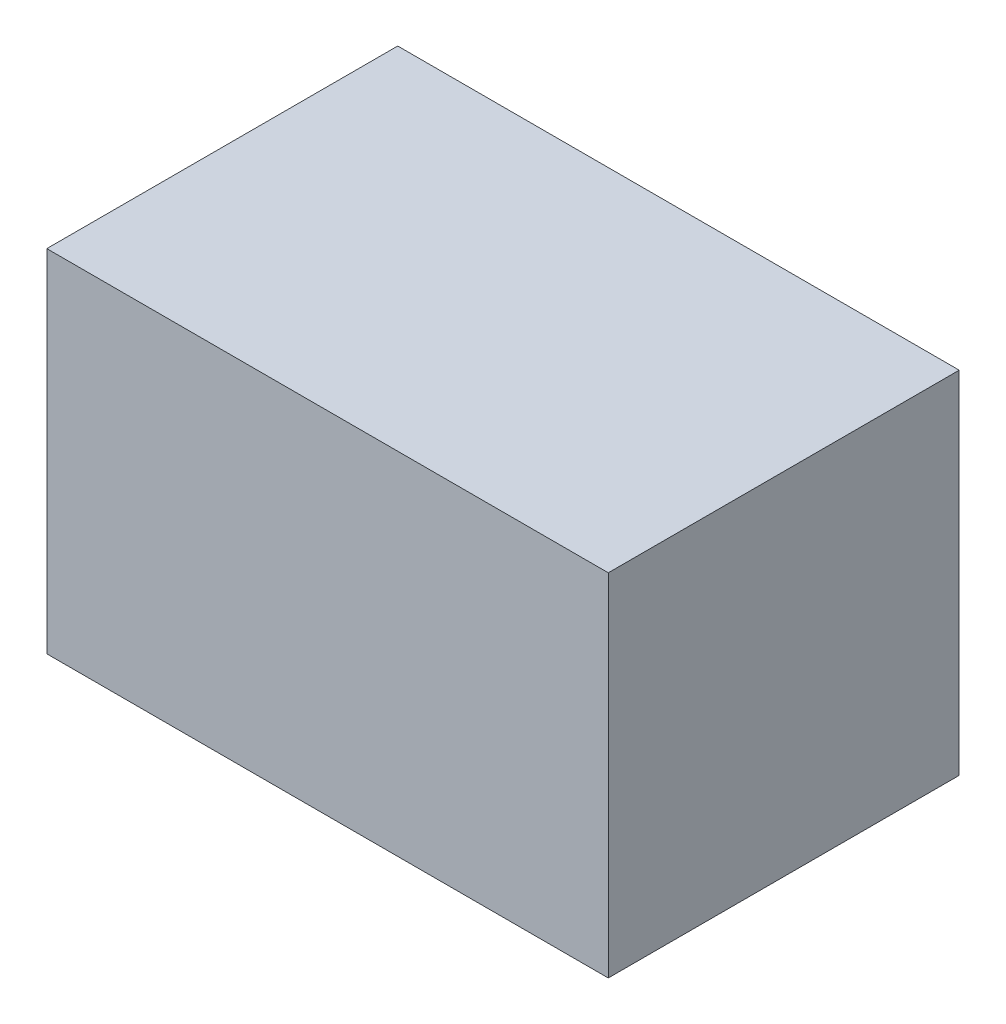
ISO-10303-21;
HEADER;
FILE_DESCRIPTION(('STEP AP214'),'2;1');
FILE_NAME('part.step','',(''),(''),'','','');
FILE_SCHEMA(('AUTOMOTIVE_DESIGN { 1 0 10303 214 1 1 1 1 }'));
ENDSEC;
DATA;
#1=APPLICATION_CONTEXT('core data for automotive mechanical design processes');
#2=APPLICATION_PROTOCOL_DEFINITION('international standard','automotive_design',2000,#1);
#3=PRODUCT_CONTEXT('',#1,'mechanical');
#4=PRODUCT('Part','Part','',(#3));
#5=PRODUCT_RELATED_PRODUCT_CATEGORY('part','',(#4));
#6=PRODUCT_DEFINITION_FORMATION('','',#4);
#7=PRODUCT_DEFINITION_CONTEXT('part definition',#1,'design');
#8=PRODUCT_DEFINITION('design','',#6,#7);
#9=PRODUCT_DEFINITION_SHAPE('','',#8);
#10=(LENGTH_UNIT() NAMED_UNIT(*) SI_UNIT(.MILLI.,.METRE.));
#11=(NAMED_UNIT(*) PLANE_ANGLE_UNIT() SI_UNIT($,.RADIAN.));
#12=(NAMED_UNIT(*) SI_UNIT($,.STERADIAN.) SOLID_ANGLE_UNIT());
#13=UNCERTAINTY_MEASURE_WITH_UNIT(LENGTH_MEASURE(1.E-05),#10,'distance_accuracy_value','');
#14=(GEOMETRIC_REPRESENTATION_CONTEXT(3) GLOBAL_UNCERTAINTY_ASSIGNED_CONTEXT((#13)) GLOBAL_UNIT_ASSIGNED_CONTEXT((#10,
#11,#12)) REPRESENTATION_CONTEXT('',''));
#15=CARTESIAN_POINT('',(0.,0.,0.));
#16=DIRECTION('',(0.,0.,1.));
#17=DIRECTION('',(1.,0.,0.));
#18=AXIS2_PLACEMENT_3D('',#15,#16,#17);
#19=CARTESIAN_POINT('',(0.,0.625,0.));
#20=DIRECTION('',(0.,-1.,0.));
#21=DIRECTION('',(0.,0.,-1.));
#22=AXIS2_PLACEMENT_3D('',#19,#20,#21);
#23=PLANE('',#22);
#24=DIRECTION('',(1.,0.,0.));
#25=VECTOR('',#24,1.);
#26=CARTESIAN_POINT('',(-1.,0.625,-0.625));
#27=LINE('',#26,#25);
#28=CARTESIAN_POINT('',(1.,0.625,-0.625));
#29=VERTEX_POINT('',#28);
#30=CARTESIAN_POINT('',(-1.,0.625,-0.625));
#31=VERTEX_POINT('',#30);
#32=EDGE_CURVE('E80',#29,#31,#27,.F.);
#33=ORIENTED_EDGE('',*,*,#32,.T.);
#34=DIRECTION('',(0.,0.,-1.));
#35=VECTOR('',#34,1.);
#36=CARTESIAN_POINT('',(-1.,0.625,0.625));
#37=LINE('',#36,#35);
#38=CARTESIAN_POINT('',(-1.,0.625,0.625));
#39=VERTEX_POINT('',#38);
#40=EDGE_CURVE('E55',#31,#39,#37,.F.);
#41=ORIENTED_EDGE('',*,*,#40,.T.);
#42=DIRECTION('',(-1.,0.,0.));
#43=VECTOR('',#42,1.);
#44=CARTESIAN_POINT('',(-1.,0.625,0.625));
#45=LINE('',#44,#43);
#46=CARTESIAN_POINT('',(1.,0.625,0.625));
#47=VERTEX_POINT('',#46);
#48=EDGE_CURVE('E57',#39,#47,#45,.F.);
#49=ORIENTED_EDGE('',*,*,#48,.T.);
#50=DIRECTION('',(0.,0.,1.));
#51=VECTOR('',#50,1.);
#52=CARTESIAN_POINT('',(1.,0.625,0.625));
#53=LINE('',#52,#51);
#54=EDGE_CURVE('E20',#47,#29,#53,.F.);
#55=ORIENTED_EDGE('',*,*,#54,.T.);
#56=EDGE_LOOP('',(#33,#41,#49,#55));
#57=FACE_BOUND('',#56,.T.);
#58=ADVANCED_FACE('F17',(#57),#23,.F.);
#59=CARTESIAN_POINT('',(1.,0.625,0.625));
#60=DIRECTION('',(-1.,0.,0.));
#61=DIRECTION('',(0.,0.,1.));
#62=AXIS2_PLACEMENT_3D('',#59,#60,#61);
#63=PLANE('',#62);
#64=DIRECTION('',(0.,1.,0.));
#65=VECTOR('',#64,1.);
#66=CARTESIAN_POINT('',(1.,0.625,-0.625));
#67=LINE('',#66,#65);
#68=CARTESIAN_POINT('',(1.,-0.625,-0.625));
#69=VERTEX_POINT('',#68);
#70=EDGE_CURVE('E68',#69,#29,#67,.T.);
#71=ORIENTED_EDGE('',*,*,#70,.T.);
#72=ORIENTED_EDGE('',*,*,#54,.F.);
#73=DIRECTION('',(0.,1.,0.));
#74=VECTOR('',#73,1.);
#75=CARTESIAN_POINT('',(1.,0.625,0.625));
#76=LINE('',#75,#74);
#77=CARTESIAN_POINT('',(1.,-0.625,0.625));
#78=VERTEX_POINT('',#77);
#79=EDGE_CURVE('E63',#47,#78,#76,.F.);
#80=ORIENTED_EDGE('',*,*,#79,.T.);
#81=DIRECTION('',(0.,0.,-1.));
#82=VECTOR('',#81,1.);
#83=CARTESIAN_POINT('',(1.,-0.625,0.));
#84=LINE('',#83,#82);
#85=EDGE_CURVE('E83',#69,#78,#84,.F.);
#86=ORIENTED_EDGE('',*,*,#85,.F.);
#87=EDGE_LOOP('',(#71,#72,#80,#86));
#88=FACE_BOUND('',#87,.T.);
#89=ADVANCED_FACE('F65',(#88),#63,.F.);
#90=CARTESIAN_POINT('',(-1.,0.625,0.625));
#91=DIRECTION('',(0.,0.,-1.));
#92=DIRECTION('',(-1.,0.,0.));
#93=AXIS2_PLACEMENT_3D('',#90,#91,#92);
#94=PLANE('',#93);
#95=ORIENTED_EDGE('',*,*,#79,.F.);
#96=ORIENTED_EDGE('',*,*,#48,.F.);
#97=DIRECTION('',(0.,1.,0.));
#98=VECTOR('',#97,1.);
#99=CARTESIAN_POINT('',(-1.,0.625,0.625));
#100=LINE('',#99,#98);
#101=CARTESIAN_POINT('',(-1.,-0.625,0.625));
#102=VERTEX_POINT('',#101);
#103=EDGE_CURVE('E75',#39,#102,#100,.F.);
#104=ORIENTED_EDGE('',*,*,#103,.T.);
#105=DIRECTION('',(1.,0.,0.));
#106=VECTOR('',#105,1.);
#107=CARTESIAN_POINT('',(0.,-0.625,0.625));
#108=LINE('',#107,#106);
#109=EDGE_CURVE('E72',#78,#102,#108,.F.);
#110=ORIENTED_EDGE('',*,*,#109,.F.);
#111=EDGE_LOOP('',(#95,#96,#104,#110));
#112=FACE_BOUND('',#111,.T.);
#113=ADVANCED_FACE('F70',(#112),#94,.F.);
#114=CARTESIAN_POINT('',(-1.,0.625,0.625));
#115=DIRECTION('',(1.,0.,0.));
#116=DIRECTION('',(0.,0.,-1.));
#117=AXIS2_PLACEMENT_3D('',#114,#115,#116);
#118=PLANE('',#117);
#119=ORIENTED_EDGE('',*,*,#103,.F.);
#120=ORIENTED_EDGE('',*,*,#40,.F.);
#121=DIRECTION('',(0.,1.,0.));
#122=VECTOR('',#121,1.);
#123=CARTESIAN_POINT('',(-1.,0.625,-0.625));
#124=LINE('',#123,#122);
#125=CARTESIAN_POINT('',(-1.,-0.625,-0.625));
#126=VERTEX_POINT('',#125);
#127=EDGE_CURVE('E35',#31,#126,#124,.F.);
#128=ORIENTED_EDGE('',*,*,#127,.T.);
#129=DIRECTION('',(0.,0.,-1.));
#130=VECTOR('',#129,1.);
#131=CARTESIAN_POINT('',(-1.,-0.625,0.));
#132=LINE('',#131,#130);
#133=EDGE_CURVE('E26',#102,#126,#132,.T.);
#134=ORIENTED_EDGE('',*,*,#133,.F.);
#135=EDGE_LOOP('',(#119,#120,#128,#134));
#136=FACE_BOUND('',#135,.T.);
#137=ADVANCED_FACE('F89',(#136),#118,.F.);
#138=CARTESIAN_POINT('',(-1.,0.625,-0.625));
#139=DIRECTION('',(0.,0.,1.));
#140=DIRECTION('',(1.,0.,0.));
#141=AXIS2_PLACEMENT_3D('',#138,#139,#140);
#142=PLANE('',#141);
#143=ORIENTED_EDGE('',*,*,#127,.F.);
#144=ORIENTED_EDGE('',*,*,#32,.F.);
#145=ORIENTED_EDGE('',*,*,#70,.F.);
#146=DIRECTION('',(1.,0.,0.));
#147=VECTOR('',#146,1.);
#148=CARTESIAN_POINT('',(0.,-0.625,-0.625));
#149=LINE('',#148,#147);
#150=EDGE_CURVE('E11',#126,#69,#149,.T.);
#151=ORIENTED_EDGE('',*,*,#150,.F.);
#152=EDGE_LOOP('',(#143,#144,#145,#151));
#153=FACE_BOUND('',#152,.T.);
#154=ADVANCED_FACE('F91',(#153),#142,.F.);
#155=CARTESIAN_POINT('',(0.,-0.625,0.));
#156=DIRECTION('',(0.,-1.,0.));
#157=DIRECTION('',(0.,0.,-1.));
#158=AXIS2_PLACEMENT_3D('',#155,#156,#157);
#159=PLANE('',#158);
#160=ORIENTED_EDGE('',*,*,#133,.T.);
#161=ORIENTED_EDGE('',*,*,#150,.T.);
#162=ORIENTED_EDGE('',*,*,#85,.T.);
#163=ORIENTED_EDGE('',*,*,#109,.T.);
#164=EDGE_LOOP('',(#160,#161,#162,#163));
#165=FACE_BOUND('',#164,.T.);
#166=ADVANCED_FACE('F88',(#165),#159,.T.);
#167=CLOSED_SHELL('',(#58,#89,#113,#137,#154,#166));
#168=MANIFOLD_SOLID_BREP('B1',#167);
#169=ADVANCED_BREP_SHAPE_REPRESENTATION('',(#18,#168),#14);
#170=SHAPE_DEFINITION_REPRESENTATION(#9,#169);
ENDSEC;
END-ISO-10303-21;
